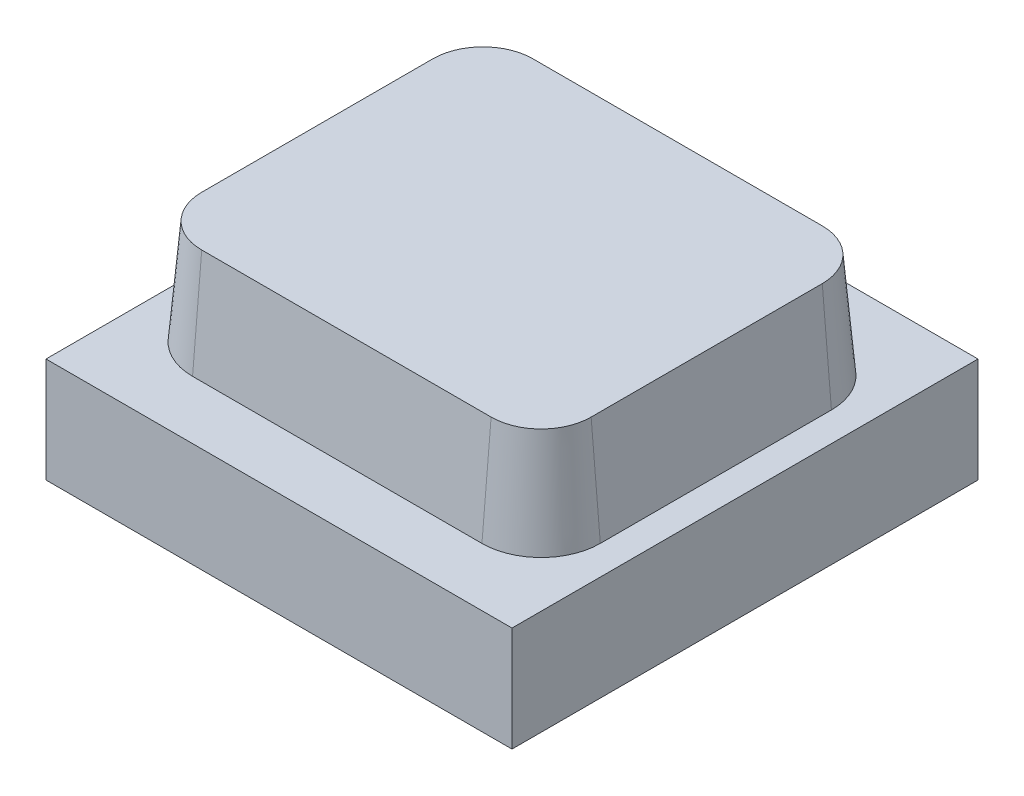
ISO-10303-21;
HEADER;
FILE_DESCRIPTION(('STEP AP214'),'2;1');
FILE_NAME('part.step','',(''),(''),'','','');
FILE_SCHEMA(('AUTOMOTIVE_DESIGN { 1 0 10303 214 1 1 1 1 }'));
ENDSEC;
DATA;
#1=APPLICATION_CONTEXT('core data for automotive mechanical design processes');
#2=APPLICATION_PROTOCOL_DEFINITION('international standard','automotive_design',2000,#1);
#3=PRODUCT_CONTEXT('',#1,'mechanical');
#4=PRODUCT('Part','Part','',(#3));
#5=PRODUCT_RELATED_PRODUCT_CATEGORY('part','',(#4));
#6=PRODUCT_DEFINITION_FORMATION('','',#4);
#7=PRODUCT_DEFINITION_CONTEXT('part definition',#1,'design');
#8=PRODUCT_DEFINITION('design','',#6,#7);
#9=PRODUCT_DEFINITION_SHAPE('','',#8);
#10=(LENGTH_UNIT() NAMED_UNIT(*) SI_UNIT(.MILLI.,.METRE.));
#11=(NAMED_UNIT(*) PLANE_ANGLE_UNIT() SI_UNIT($,.RADIAN.));
#12=(NAMED_UNIT(*) SI_UNIT($,.STERADIAN.) SOLID_ANGLE_UNIT());
#13=UNCERTAINTY_MEASURE_WITH_UNIT(LENGTH_MEASURE(1.E-05),#10,'distance_accuracy_value','');
#14=(GEOMETRIC_REPRESENTATION_CONTEXT(3) GLOBAL_UNCERTAINTY_ASSIGNED_CONTEXT((#13)) GLOBAL_UNIT_ASSIGNED_CONTEXT((#10,
#11,#12)) REPRESENTATION_CONTEXT('',''));
#15=CARTESIAN_POINT('',(0.,0.,0.));
#16=DIRECTION('',(0.,0.,1.));
#17=DIRECTION('',(1.,0.,0.));
#18=AXIS2_PLACEMENT_3D('',#15,#16,#17);
#19=CARTESIAN_POINT('',(-0.621,0.45,0.496));
#20=DIRECTION('',(0.,-1.,0.));
#21=DIRECTION('',(0.,0.,1.));
#22=AXIS2_PLACEMENT_3D('',#19,#20,#21);
#23=CONICAL_SURFACE('',#22,0.254,0.0872664625997167);
#24=CARTESIAN_POINT('',(-0.621,0.9,0.496));
#25=DIRECTION('',(0.,1.,0.));
#26=DIRECTION('',(0.,0.,1.));
#27=AXIS2_PLACEMENT_3D('',#24,#25,#26);
#28=CIRCLE('',#27,0.214630101413334);
#29=CARTESIAN_POINT('',(-0.835630101413334,0.9,0.496));
#30=VERTEX_POINT('',#29);
#31=CARTESIAN_POINT('',(-0.621,0.9,0.710630101413334));
#32=VERTEX_POINT('',#31);
#33=EDGE_CURVE('E147',#30,#32,#28,.T.);
#34=ORIENTED_EDGE('',*,*,#33,.F.);
#35=DIRECTION('',(-0.0871557427476584,-0.996194698091745,0.));
#36=VECTOR('',#35,1.);
#37=CARTESIAN_POINT('',(-0.875,0.45,0.496));
#38=LINE('',#37,#36);
#39=CARTESIAN_POINT('',(-0.875,0.45,0.496));
#40=VERTEX_POINT('',#39);
#41=EDGE_CURVE('E52',#30,#40,#38,.T.);
#42=ORIENTED_EDGE('',*,*,#41,.T.);
#43=CARTESIAN_POINT('',(-0.621,0.45,0.496));
#44=DIRECTION('',(0.,1.,0.));
#45=DIRECTION('',(0.,0.,1.));
#46=AXIS2_PLACEMENT_3D('',#43,#44,#45);
#47=CIRCLE('',#46,0.254);
#48=CARTESIAN_POINT('',(-0.621,0.45,0.75));
#49=VERTEX_POINT('',#48);
#50=EDGE_CURVE('E155',#40,#49,#47,.T.);
#51=ORIENTED_EDGE('',*,*,#50,.T.);
#52=DIRECTION('',(0.,-0.996194698091745,0.0871557427476584));
#53=VECTOR('',#52,1.);
#54=CARTESIAN_POINT('',(-0.621,0.45,0.75));
#55=LINE('',#54,#53);
#56=EDGE_CURVE('E103',#32,#49,#55,.T.);
#57=ORIENTED_EDGE('',*,*,#56,.F.);
#58=EDGE_LOOP('',(#34,#42,#51,#57));
#59=FACE_BOUND('',#58,.T.);
#60=ADVANCED_FACE('F48',(#59),#23,.T.);
#61=CARTESIAN_POINT('',(-0.621,0.45,0.75));
#62=DIRECTION('',(0.,0.0871557427476584,0.996194698091746));
#63=DIRECTION('',(0.,-0.996194698091746,0.0871557427476584));
#64=AXIS2_PLACEMENT_3D('',#61,#62,#63);
#65=PLANE('',#64);
#66=DIRECTION('',(-1.,0.,0.));
#67=VECTOR('',#66,1.);
#68=CARTESIAN_POINT('',(-0.621,0.9,0.710630101413334));
#69=LINE('',#68,#67);
#70=CARTESIAN_POINT('',(0.621,0.9,0.710630101413334));
#71=VERTEX_POINT('',#70);
#72=EDGE_CURVE('E110',#32,#71,#69,.F.);
#73=ORIENTED_EDGE('',*,*,#72,.F.);
#74=ORIENTED_EDGE('',*,*,#56,.T.);
#75=DIRECTION('',(1.,0.,0.));
#76=VECTOR('',#75,1.);
#77=CARTESIAN_POINT('',(-0.621,0.45,0.75));
#78=LINE('',#77,#76);
#79=CARTESIAN_POINT('',(0.621,0.45,0.75));
#80=VERTEX_POINT('',#79);
#81=EDGE_CURVE('E154',#49,#80,#78,.T.);
#82=ORIENTED_EDGE('',*,*,#81,.T.);
#83=DIRECTION('',(0.,-0.996194698091745,0.0871557427476584));
#84=VECTOR('',#83,1.);
#85=CARTESIAN_POINT('',(0.621,0.45,0.75));
#86=LINE('',#85,#84);
#87=EDGE_CURVE('E156',#71,#80,#86,.T.);
#88=ORIENTED_EDGE('',*,*,#87,.F.);
#89=EDGE_LOOP('',(#73,#74,#82,#88));
#90=FACE_BOUND('',#89,.T.);
#91=ADVANCED_FACE('F185',(#90),#65,.T.);
#92=CARTESIAN_POINT('',(0.621,0.45,0.496));
#93=DIRECTION('',(0.,-1.,0.));
#94=DIRECTION('',(0.,0.,1.));
#95=AXIS2_PLACEMENT_3D('',#92,#93,#94);
#96=CONICAL_SURFACE('',#95,0.254,0.0872664625997167);
#97=CARTESIAN_POINT('',(0.621,0.9,0.496));
#98=DIRECTION('',(0.,1.,0.));
#99=DIRECTION('',(0.,0.,1.));
#100=AXIS2_PLACEMENT_3D('',#97,#98,#99);
#101=CIRCLE('',#100,0.214630101413334);
#102=CARTESIAN_POINT('',(0.835630101413334,0.9,0.496));
#103=VERTEX_POINT('',#102);
#104=EDGE_CURVE('E143',#71,#103,#101,.T.);
#105=ORIENTED_EDGE('',*,*,#104,.F.);
#106=ORIENTED_EDGE('',*,*,#87,.T.);
#107=CARTESIAN_POINT('',(0.621,0.45,0.496));
#108=DIRECTION('',(0.,1.,0.));
#109=DIRECTION('',(0.,0.,1.));
#110=AXIS2_PLACEMENT_3D('',#107,#108,#109);
#111=CIRCLE('',#110,0.254);
#112=CARTESIAN_POINT('',(0.875,0.45,0.496));
#113=VERTEX_POINT('',#112);
#114=EDGE_CURVE('E158',#80,#113,#111,.T.);
#115=ORIENTED_EDGE('',*,*,#114,.T.);
#116=DIRECTION('',(0.0871557427476584,-0.996194698091745,0.));
#117=VECTOR('',#116,1.);
#118=CARTESIAN_POINT('',(0.875,0.45,0.496));
#119=LINE('',#118,#117);
#120=EDGE_CURVE('E159',#103,#113,#119,.T.);
#121=ORIENTED_EDGE('',*,*,#120,.F.);
#122=EDGE_LOOP('',(#105,#106,#115,#121));
#123=FACE_BOUND('',#122,.T.);
#124=ADVANCED_FACE('F188',(#123),#96,.T.);
#125=CARTESIAN_POINT('',(0.875,0.45,-0.496));
#126=DIRECTION('',(0.996194698091746,0.0871557427476584,0.));
#127=DIRECTION('',(-0.0871557427476584,0.996194698091746,0.));
#128=AXIS2_PLACEMENT_3D('',#125,#126,#127);
#129=PLANE('',#128);
#130=DIRECTION('',(0.,0.,1.));
#131=VECTOR('',#130,1.);
#132=CARTESIAN_POINT('',(0.835630101413334,0.9,-0.496));
#133=LINE('',#132,#131);
#134=CARTESIAN_POINT('',(0.835630101413334,0.9,-0.496));
#135=VERTEX_POINT('',#134);
#136=EDGE_CURVE('E138',#103,#135,#133,.F.);
#137=ORIENTED_EDGE('',*,*,#136,.F.);
#138=ORIENTED_EDGE('',*,*,#120,.T.);
#139=DIRECTION('',(0.,0.,-1.));
#140=VECTOR('',#139,1.);
#141=CARTESIAN_POINT('',(0.875,0.45,-0.496));
#142=LINE('',#141,#140);
#143=CARTESIAN_POINT('',(0.875,0.45,-0.496));
#144=VERTEX_POINT('',#143);
#145=EDGE_CURVE('E161',#113,#144,#142,.T.);
#146=ORIENTED_EDGE('',*,*,#145,.T.);
#147=DIRECTION('',(0.0871557427476584,-0.996194698091745,0.));
#148=VECTOR('',#147,1.);
#149=CARTESIAN_POINT('',(0.875,0.45,-0.496));
#150=LINE('',#149,#148);
#151=EDGE_CURVE('E162',#135,#144,#150,.T.);
#152=ORIENTED_EDGE('',*,*,#151,.F.);
#153=EDGE_LOOP('',(#137,#138,#146,#152));
#154=FACE_BOUND('',#153,.T.);
#155=ADVANCED_FACE('F190',(#154),#129,.T.);
#156=CARTESIAN_POINT('',(0.621,0.45,-0.496));
#157=DIRECTION('',(0.,-1.,0.));
#158=DIRECTION('',(0.,0.,-1.));
#159=AXIS2_PLACEMENT_3D('',#156,#157,#158);
#160=CONICAL_SURFACE('',#159,0.254,0.0872664625997167);
#161=CARTESIAN_POINT('',(0.621,0.9,-0.496));
#162=DIRECTION('',(0.,1.,0.));
#163=DIRECTION('',(0.,0.,1.));
#164=AXIS2_PLACEMENT_3D('',#161,#162,#163);
#165=CIRCLE('',#164,0.214630101413334);
#166=CARTESIAN_POINT('',(0.621,0.9,-0.710630101413334));
#167=VERTEX_POINT('',#166);
#168=EDGE_CURVE('E136',#135,#167,#165,.T.);
#169=ORIENTED_EDGE('',*,*,#168,.F.);
#170=ORIENTED_EDGE('',*,*,#151,.T.);
#171=CARTESIAN_POINT('',(0.621,0.45,-0.496));
#172=DIRECTION('',(0.,1.,0.));
#173=DIRECTION('',(0.,0.,-1.));
#174=AXIS2_PLACEMENT_3D('',#171,#172,#173);
#175=CIRCLE('',#174,0.254);
#176=CARTESIAN_POINT('',(0.621,0.45,-0.75));
#177=VERTEX_POINT('',#176);
#178=EDGE_CURVE('E164',#144,#177,#175,.T.);
#179=ORIENTED_EDGE('',*,*,#178,.T.);
#180=DIRECTION('',(0.,-0.996194698091745,-0.0871557427476584));
#181=VECTOR('',#180,1.);
#182=CARTESIAN_POINT('',(0.621,0.45,-0.75));
#183=LINE('',#182,#181);
#184=EDGE_CURVE('E165',#167,#177,#183,.T.);
#185=ORIENTED_EDGE('',*,*,#184,.F.);
#186=EDGE_LOOP('',(#169,#170,#179,#185));
#187=FACE_BOUND('',#186,.T.);
#188=ADVANCED_FACE('F194',(#187),#160,.T.);
#189=CARTESIAN_POINT('',(-0.621,0.45,-0.75));
#190=DIRECTION('',(0.,0.0871557427476584,-0.996194698091746));
#191=DIRECTION('',(0.,0.996194698091746,0.0871557427476584));
#192=AXIS2_PLACEMENT_3D('',#189,#190,#191);
#193=PLANE('',#192);
#194=DIRECTION('',(1.,0.,0.));
#195=VECTOR('',#194,1.);
#196=CARTESIAN_POINT('',(-0.621,0.9,-0.710630101413334));
#197=LINE('',#196,#195);
#198=CARTESIAN_POINT('',(-0.621,0.9,-0.710630101413334));
#199=VERTEX_POINT('',#198);
#200=EDGE_CURVE('E57',#167,#199,#197,.F.);
#201=ORIENTED_EDGE('',*,*,#200,.F.);
#202=ORIENTED_EDGE('',*,*,#184,.T.);
#203=DIRECTION('',(-1.,0.,0.));
#204=VECTOR('',#203,1.);
#205=CARTESIAN_POINT('',(-0.621,0.45,-0.75));
#206=LINE('',#205,#204);
#207=CARTESIAN_POINT('',(-0.621,0.45,-0.75));
#208=VERTEX_POINT('',#207);
#209=EDGE_CURVE('E130',#177,#208,#206,.T.);
#210=ORIENTED_EDGE('',*,*,#209,.T.);
#211=DIRECTION('',(0.,-0.996194698091745,-0.0871557427476584));
#212=VECTOR('',#211,1.);
#213=CARTESIAN_POINT('',(-0.621,0.45,-0.75));
#214=LINE('',#213,#212);
#215=EDGE_CURVE('E121',#199,#208,#214,.T.);
#216=ORIENTED_EDGE('',*,*,#215,.F.);
#217=EDGE_LOOP('',(#201,#202,#210,#216));
#218=FACE_BOUND('',#217,.T.);
#219=ADVANCED_FACE('F127',(#218),#193,.T.);
#220=CARTESIAN_POINT('',(-0.621,0.45,-0.496));
#221=DIRECTION('',(0.,-1.,0.));
#222=DIRECTION('',(0.,0.,1.));
#223=AXIS2_PLACEMENT_3D('',#220,#221,#222);
#224=CONICAL_SURFACE('',#223,0.254,0.0872664625997167);
#225=CARTESIAN_POINT('',(-0.621,0.9,-0.496));
#226=DIRECTION('',(0.,1.,0.));
#227=DIRECTION('',(0.,0.,1.));
#228=AXIS2_PLACEMENT_3D('',#225,#226,#227);
#229=CIRCLE('',#228,0.214630101413334);
#230=CARTESIAN_POINT('',(-0.835630101413334,0.9,-0.496));
#231=VERTEX_POINT('',#230);
#232=EDGE_CURVE('E13',#199,#231,#229,.T.);
#233=ORIENTED_EDGE('',*,*,#232,.F.);
#234=ORIENTED_EDGE('',*,*,#215,.T.);
#235=CARTESIAN_POINT('',(-0.621,0.45,-0.496));
#236=DIRECTION('',(0.,1.,0.));
#237=DIRECTION('',(0.,0.,1.));
#238=AXIS2_PLACEMENT_3D('',#235,#236,#237);
#239=CIRCLE('',#238,0.254);
#240=CARTESIAN_POINT('',(-0.875,0.45,-0.496));
#241=VERTEX_POINT('',#240);
#242=EDGE_CURVE('E132',#208,#241,#239,.T.);
#243=ORIENTED_EDGE('',*,*,#242,.T.);
#244=DIRECTION('',(-0.0871557427476584,-0.996194698091745,0.));
#245=VECTOR('',#244,1.);
#246=CARTESIAN_POINT('',(-0.875,0.45,-0.496));
#247=LINE('',#246,#245);
#248=EDGE_CURVE('E70',#231,#241,#247,.T.);
#249=ORIENTED_EDGE('',*,*,#248,.F.);
#250=EDGE_LOOP('',(#233,#234,#243,#249));
#251=FACE_BOUND('',#250,.T.);
#252=ADVANCED_FACE('F120',(#251),#224,.T.);
#253=CARTESIAN_POINT('',(-0.875,0.45,-0.496));
#254=DIRECTION('',(-0.996194698091746,0.0871557427476584,0.));
#255=DIRECTION('',(-0.0871557427476584,-0.996194698091746,0.));
#256=AXIS2_PLACEMENT_3D('',#253,#254,#255);
#257=PLANE('',#256);
#258=DIRECTION('',(0.,0.,-1.));
#259=VECTOR('',#258,1.);
#260=CARTESIAN_POINT('',(-0.835630101413334,0.9,-0.496));
#261=LINE('',#260,#259);
#262=EDGE_CURVE('E150',#231,#30,#261,.F.);
#263=ORIENTED_EDGE('',*,*,#262,.F.);
#264=ORIENTED_EDGE('',*,*,#248,.T.);
#265=DIRECTION('',(0.,0.,1.));
#266=VECTOR('',#265,1.);
#267=CARTESIAN_POINT('',(-0.875,0.45,-0.496));
#268=LINE('',#267,#266);
#269=EDGE_CURVE('E152',#241,#40,#268,.T.);
#270=ORIENTED_EDGE('',*,*,#269,.T.);
#271=ORIENTED_EDGE('',*,*,#41,.F.);
#272=EDGE_LOOP('',(#263,#264,#270,#271));
#273=FACE_BOUND('',#272,.T.);
#274=ADVANCED_FACE('F180',(#273),#257,.T.);
#275=CARTESIAN_POINT('',(-0.621,0.45,0.496));
#276=DIRECTION('',(0.,1.,0.));
#277=DIRECTION('',(0.,0.,1.));
#278=AXIS2_PLACEMENT_3D('',#275,#276,#277);
#279=PLANE('',#278);
#280=ORIENTED_EDGE('',*,*,#50,.F.);
#281=ORIENTED_EDGE('',*,*,#269,.F.);
#282=ORIENTED_EDGE('',*,*,#242,.F.);
#283=ORIENTED_EDGE('',*,*,#209,.F.);
#284=ORIENTED_EDGE('',*,*,#178,.F.);
#285=ORIENTED_EDGE('',*,*,#145,.F.);
#286=ORIENTED_EDGE('',*,*,#114,.F.);
#287=ORIENTED_EDGE('',*,*,#81,.F.);
#288=EDGE_LOOP('',(#280,#281,#282,#283,#284,#285,#286,#287));
#289=FACE_BOUND('',#288,.T.);
#290=ADVANCED_FACE('F182',(#289),#279,.F.);
#291=CARTESIAN_POINT('',(0.,0.9,0.));
#292=DIRECTION('',(0.,1.,0.));
#293=DIRECTION('',(0.,0.,1.));
#294=AXIS2_PLACEMENT_3D('',#291,#292,#293);
#295=PLANE('',#294);
#296=ORIENTED_EDGE('',*,*,#262,.T.);
#297=ORIENTED_EDGE('',*,*,#33,.T.);
#298=ORIENTED_EDGE('',*,*,#72,.T.);
#299=ORIENTED_EDGE('',*,*,#104,.T.);
#300=ORIENTED_EDGE('',*,*,#136,.T.);
#301=ORIENTED_EDGE('',*,*,#168,.T.);
#302=ORIENTED_EDGE('',*,*,#200,.T.);
#303=ORIENTED_EDGE('',*,*,#232,.T.);
#304=EDGE_LOOP('',(#296,#297,#298,#299,#300,#301,#302,#303));
#305=FACE_BOUND('',#304,.T.);
#306=ADVANCED_FACE('F50',(#305),#295,.T.);
#307=CLOSED_SHELL('',(#60,#91,#124,#155,#188,#219,#252,#274,#290,#306));
#308=MANIFOLD_SOLID_BREP('B2',#307);
#309=CARTESIAN_POINT('',(-1.,0.45,-1.));
#310=DIRECTION('',(1.,0.,0.));
#311=DIRECTION('',(0.,0.,-1.));
#312=AXIS2_PLACEMENT_3D('',#309,#310,#311);
#313=PLANE('',#312);
#314=DIRECTION('',(0.,0.,1.));
#315=VECTOR('',#314,1.);
#316=CARTESIAN_POINT('',(-1.,0.,-1.));
#317=LINE('',#316,#315);
#318=CARTESIAN_POINT('',(-1.,0.,-1.));
#319=VERTEX_POINT('',#318);
#320=CARTESIAN_POINT('',(-1.,0.,1.));
#321=VERTEX_POINT('',#320);
#322=EDGE_CURVE('E339',#319,#321,#317,.T.);
#323=ORIENTED_EDGE('',*,*,#322,.T.);
#324=DIRECTION('',(0.,-1.,0.));
#325=VECTOR('',#324,1.);
#326=CARTESIAN_POINT('',(-1.,0.45,1.));
#327=LINE('',#326,#325);
#328=CARTESIAN_POINT('',(-1.,0.45,1.));
#329=VERTEX_POINT('',#328);
#330=EDGE_CURVE('E46',#329,#321,#327,.T.);
#331=ORIENTED_EDGE('',*,*,#330,.F.);
#332=DIRECTION('',(0.,0.,1.));
#333=VECTOR('',#332,1.);
#334=CARTESIAN_POINT('',(-1.,0.45,-1.));
#335=LINE('',#334,#333);
#336=CARTESIAN_POINT('',(-1.,0.45,-1.));
#337=VERTEX_POINT('',#336);
#338=EDGE_CURVE('E327',#337,#329,#335,.T.);
#339=ORIENTED_EDGE('',*,*,#338,.F.);
#340=DIRECTION('',(0.,-1.,0.));
#341=VECTOR('',#340,1.);
#342=CARTESIAN_POINT('',(-1.,0.45,-1.));
#343=LINE('',#342,#341);
#344=EDGE_CURVE('E335',#337,#319,#343,.T.);
#345=ORIENTED_EDGE('',*,*,#344,.T.);
#346=EDGE_LOOP('',(#323,#331,#339,#345));
#347=FACE_BOUND('',#346,.T.);
#348=ADVANCED_FACE('F276',(#347),#313,.F.);
#349=CARTESIAN_POINT('',(-1.,0.45,1.));
#350=DIRECTION('',(0.,0.,-1.));
#351=DIRECTION('',(-1.,0.,0.));
#352=AXIS2_PLACEMENT_3D('',#349,#350,#351);
#353=PLANE('',#352);
#354=DIRECTION('',(1.,0.,0.));
#355=VECTOR('',#354,1.);
#356=CARTESIAN_POINT('',(-1.,0.,1.));
#357=LINE('',#356,#355);
#358=CARTESIAN_POINT('',(1.,0.,1.));
#359=VERTEX_POINT('',#358);
#360=EDGE_CURVE('E331',#321,#359,#357,.T.);
#361=ORIENTED_EDGE('',*,*,#360,.T.);
#362=DIRECTION('',(0.,-1.,0.));
#363=VECTOR('',#362,1.);
#364=CARTESIAN_POINT('',(1.,0.45,1.));
#365=LINE('',#364,#363);
#366=CARTESIAN_POINT('',(1.,0.45,1.));
#367=VERTEX_POINT('',#366);
#368=EDGE_CURVE('E284',#367,#359,#365,.T.);
#369=ORIENTED_EDGE('',*,*,#368,.F.);
#370=DIRECTION('',(1.,0.,0.));
#371=VECTOR('',#370,1.);
#372=CARTESIAN_POINT('',(-1.,0.45,1.));
#373=LINE('',#372,#371);
#374=EDGE_CURVE('E322',#329,#367,#373,.T.);
#375=ORIENTED_EDGE('',*,*,#374,.F.);
#376=ORIENTED_EDGE('',*,*,#330,.T.);
#377=EDGE_LOOP('',(#361,#369,#375,#376));
#378=FACE_BOUND('',#377,.T.);
#379=ADVANCED_FACE('F330',(#378),#353,.F.);
#380=CARTESIAN_POINT('',(1.,0.45,-1.));
#381=DIRECTION('',(-1.,0.,0.));
#382=DIRECTION('',(0.,0.,1.));
#383=AXIS2_PLACEMENT_3D('',#380,#381,#382);
#384=PLANE('',#383);
#385=DIRECTION('',(0.,0.,-1.));
#386=VECTOR('',#385,1.);
#387=CARTESIAN_POINT('',(1.,0.,-1.));
#388=LINE('',#387,#386);
#389=CARTESIAN_POINT('',(1.,0.,-1.));
#390=VERTEX_POINT('',#389);
#391=EDGE_CURVE('E309',#359,#390,#388,.T.);
#392=ORIENTED_EDGE('',*,*,#391,.T.);
#393=DIRECTION('',(0.,-1.,0.));
#394=VECTOR('',#393,1.);
#395=CARTESIAN_POINT('',(1.,0.45,-1.));
#396=LINE('',#395,#394);
#397=CARTESIAN_POINT('',(1.,0.45,-1.));
#398=VERTEX_POINT('',#397);
#399=EDGE_CURVE('E332',#398,#390,#396,.T.);
#400=ORIENTED_EDGE('',*,*,#399,.F.);
#401=DIRECTION('',(0.,0.,-1.));
#402=VECTOR('',#401,1.);
#403=CARTESIAN_POINT('',(1.,0.45,-1.));
#404=LINE('',#403,#402);
#405=EDGE_CURVE('E325',#367,#398,#404,.T.);
#406=ORIENTED_EDGE('',*,*,#405,.F.);
#407=ORIENTED_EDGE('',*,*,#368,.T.);
#408=EDGE_LOOP('',(#392,#400,#406,#407));
#409=FACE_BOUND('',#408,.T.);
#410=ADVANCED_FACE('F333',(#409),#384,.F.);
#411=CARTESIAN_POINT('',(-1.,0.45,-1.));
#412=DIRECTION('',(0.,0.,1.));
#413=DIRECTION('',(1.,0.,0.));
#414=AXIS2_PLACEMENT_3D('',#411,#412,#413);
#415=PLANE('',#414);
#416=DIRECTION('',(-1.,0.,0.));
#417=VECTOR('',#416,1.);
#418=CARTESIAN_POINT('',(-1.,0.,-1.));
#419=LINE('',#418,#417);
#420=EDGE_CURVE('E315',#390,#319,#419,.T.);
#421=ORIENTED_EDGE('',*,*,#420,.T.);
#422=ORIENTED_EDGE('',*,*,#344,.F.);
#423=DIRECTION('',(-1.,0.,0.));
#424=VECTOR('',#423,1.);
#425=CARTESIAN_POINT('',(-1.,0.45,-1.));
#426=LINE('',#425,#424);
#427=EDGE_CURVE('E292',#398,#337,#426,.T.);
#428=ORIENTED_EDGE('',*,*,#427,.F.);
#429=ORIENTED_EDGE('',*,*,#399,.T.);
#430=EDGE_LOOP('',(#421,#422,#428,#429));
#431=FACE_BOUND('',#430,.T.);
#432=ADVANCED_FACE('F346',(#431),#415,.F.);
#433=CARTESIAN_POINT('',(0.,0.45,0.));
#434=DIRECTION('',(0.,1.,0.));
#435=DIRECTION('',(0.,0.,1.));
#436=AXIS2_PLACEMENT_3D('',#433,#434,#435);
#437=PLANE('',#436);
#438=ORIENTED_EDGE('',*,*,#338,.T.);
#439=ORIENTED_EDGE('',*,*,#374,.T.);
#440=ORIENTED_EDGE('',*,*,#405,.T.);
#441=ORIENTED_EDGE('',*,*,#427,.T.);
#442=EDGE_LOOP('',(#438,#439,#440,#441));
#443=FACE_BOUND('',#442,.T.);
#444=ADVANCED_FACE('F323',(#443),#437,.T.);
#445=CARTESIAN_POINT('',(0.,0.,0.));
#446=DIRECTION('',(0.,1.,0.));
#447=DIRECTION('',(0.,0.,1.));
#448=AXIS2_PLACEMENT_3D('',#445,#446,#447);
#449=PLANE('',#448);
#450=ORIENTED_EDGE('',*,*,#322,.F.);
#451=ORIENTED_EDGE('',*,*,#420,.F.);
#452=ORIENTED_EDGE('',*,*,#391,.F.);
#453=ORIENTED_EDGE('',*,*,#360,.F.);
#454=EDGE_LOOP('',(#450,#451,#452,#453));
#455=FACE_BOUND('',#454,.T.);
#456=ADVANCED_FACE('F349',(#455),#449,.F.);
#457=CLOSED_SHELL('',(#348,#379,#410,#432,#444,#456));
#458=MANIFOLD_SOLID_BREP('B7',#457);
#459=ADVANCED_BREP_SHAPE_REPRESENTATION('',(#18,#308,#458),#14);
#460=SHAPE_DEFINITION_REPRESENTATION(#9,#459);
ENDSEC;
END-ISO-10303-21;
